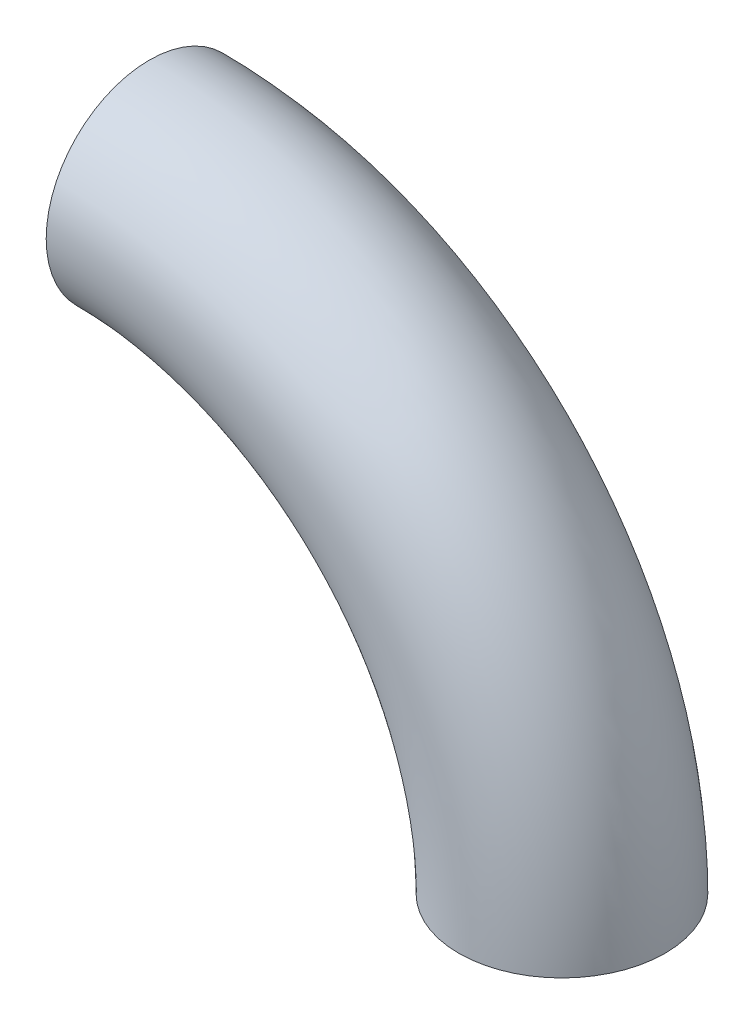
ISO-10303-21;
HEADER;
FILE_DESCRIPTION(('STEP AP214'),'2;1');
FILE_NAME('part.step','',(''),(''),'','','');
FILE_SCHEMA(('AUTOMOTIVE_DESIGN { 1 0 10303 214 1 1 1 1 }'));
ENDSEC;
DATA;
#1=APPLICATION_CONTEXT('core data for automotive mechanical design processes');
#2=APPLICATION_PROTOCOL_DEFINITION('international standard','automotive_design',2000,#1);
#3=PRODUCT_CONTEXT('',#1,'mechanical');
#4=PRODUCT('Part','Part','',(#3));
#5=PRODUCT_RELATED_PRODUCT_CATEGORY('part','',(#4));
#6=PRODUCT_DEFINITION_FORMATION('','',#4);
#7=PRODUCT_DEFINITION_CONTEXT('part definition',#1,'design');
#8=PRODUCT_DEFINITION('design','',#6,#7);
#9=PRODUCT_DEFINITION_SHAPE('','',#8);
#10=(LENGTH_UNIT() NAMED_UNIT(*) SI_UNIT(.MILLI.,.METRE.));
#11=(NAMED_UNIT(*) PLANE_ANGLE_UNIT() SI_UNIT($,.RADIAN.));
#12=(NAMED_UNIT(*) SI_UNIT($,.STERADIAN.) SOLID_ANGLE_UNIT());
#13=UNCERTAINTY_MEASURE_WITH_UNIT(LENGTH_MEASURE(1.E-05),#10,'distance_accuracy_value','');
#14=(GEOMETRIC_REPRESENTATION_CONTEXT(3) GLOBAL_UNCERTAINTY_ASSIGNED_CONTEXT((#13)) GLOBAL_UNIT_ASSIGNED_CONTEXT((#10,
#11,#12)) REPRESENTATION_CONTEXT('',''));
#15=CARTESIAN_POINT('',(0.,0.,0.));
#16=DIRECTION('',(0.,0.,1.));
#17=DIRECTION('',(1.,0.,0.));
#18=AXIS2_PLACEMENT_3D('',#15,#16,#17);
#19=CARTESIAN_POINT('',(0.,0.,0.));
#20=DIRECTION('',(0.,0.,-1.));
#21=DIRECTION('',(-1.,0.,0.));
#22=AXIS2_PLACEMENT_3D('',#19,#20,#21);
#23=TOROIDAL_SURFACE('',#22,20.,5.);
#24=CARTESIAN_POINT('',(0.,20.,0.));
#25=DIRECTION('',(1.,0.,0.));
#26=DIRECTION('',(0.,0.,-1.));
#27=AXIS2_PLACEMENT_3D('',#24,#25,#26);
#28=CIRCLE('',#27,5.);
#29=CARTESIAN_POINT('',(0.,25.,0.));
#30=VERTEX_POINT('',#29);
#31=EDGE_CURVE('E10',#30,#30,#28,.T.);
#32=CARTESIAN_POINT('',(20.,0.,0.));
#33=DIRECTION('',(0.,-1.,0.));
#34=DIRECTION('',(0.,0.,-1.));
#35=AXIS2_PLACEMENT_3D('',#32,#33,#34);
#36=CIRCLE('',#35,5.);
#37=CARTESIAN_POINT('',(25.,0.,0.));
#38=VERTEX_POINT('',#37);
#39=EDGE_CURVE('E47',#38,#38,#36,.T.);
#40=CARTESIAN_POINT('',(0.,0.,0.));
#41=DIRECTION('',(0.,0.,-1.));
#42=DIRECTION('',(-1.,0.,0.));
#43=AXIS2_PLACEMENT_3D('',#40,#41,#42);
#44=CIRCLE('',#43,25.);
#45=EDGE_CURVE('',#30,#38,#44,.T.);
#46=ORIENTED_EDGE('',*,*,#31,.T.);
#47=ORIENTED_EDGE('',*,*,#39,.F.);
#48=ORIENTED_EDGE('',*,*,#45,.T.);
#49=ORIENTED_EDGE('',*,*,#45,.F.);
#50=EDGE_LOOP('',(#46,#48,#47,#49));
#51=FACE_BOUND('',#50,.T.);
#52=ADVANCED_FACE('F41',(#51),#23,.T.);
#53=CARTESIAN_POINT('',(0.,20.,0.));
#54=DIRECTION('',(1.,0.,0.));
#55=DIRECTION('',(0.,0.,-1.));
#56=AXIS2_PLACEMENT_3D('',#53,#54,#55);
#57=PLANE('',#56);
#58=ORIENTED_EDGE('',*,*,#31,.F.);
#59=EDGE_LOOP('',(#58));
#60=FACE_BOUND('',#59,.T.);
#61=ADVANCED_FACE('F56',(#60),#57,.F.);
#62=CARTESIAN_POINT('',(20.,0.,0.));
#63=DIRECTION('',(0.,-1.,0.));
#64=DIRECTION('',(0.,0.,-1.));
#65=AXIS2_PLACEMENT_3D('',#62,#63,#64);
#66=PLANE('',#65);
#67=ORIENTED_EDGE('',*,*,#39,.T.);
#68=EDGE_LOOP('',(#67));
#69=FACE_BOUND('',#68,.T.);
#70=ADVANCED_FACE('F53',(#69),#66,.T.);
#71=CLOSED_SHELL('',(#52,#61,#70));
#72=MANIFOLD_SOLID_BREP('B2',#71);
#73=ADVANCED_BREP_SHAPE_REPRESENTATION('',(#18,#72),#14);
#74=SHAPE_DEFINITION_REPRESENTATION(#9,#73);
ENDSEC;
END-ISO-10303-21;
